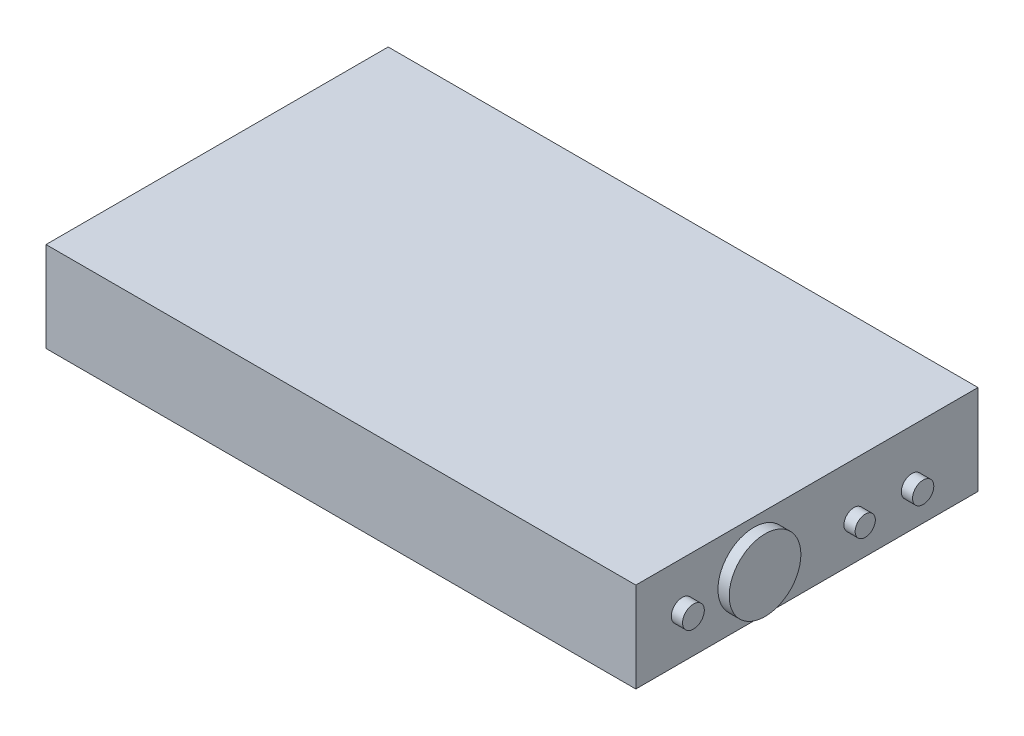
ISO-10303-21;
HEADER;
FILE_DESCRIPTION(('STEP AP214'),'2;1');
FILE_NAME('part.step','',(''),(''),'','','');
FILE_SCHEMA(('AUTOMOTIVE_DESIGN { 1 0 10303 214 1 1 1 1 }'));
ENDSEC;
DATA;
#1=APPLICATION_CONTEXT('core data for automotive mechanical design processes');
#2=APPLICATION_PROTOCOL_DEFINITION('international standard','automotive_design',2000,#1);
#3=PRODUCT_CONTEXT('',#1,'mechanical');
#4=PRODUCT('Part','Part','',(#3));
#5=PRODUCT_RELATED_PRODUCT_CATEGORY('part','',(#4));
#6=PRODUCT_DEFINITION_FORMATION('','',#4);
#7=PRODUCT_DEFINITION_CONTEXT('part definition',#1,'design');
#8=PRODUCT_DEFINITION('design','',#6,#7);
#9=PRODUCT_DEFINITION_SHAPE('','',#8);
#10=(LENGTH_UNIT() NAMED_UNIT(*) SI_UNIT(.MILLI.,.METRE.));
#11=(NAMED_UNIT(*) PLANE_ANGLE_UNIT() SI_UNIT($,.RADIAN.));
#12=(NAMED_UNIT(*) SI_UNIT($,.STERADIAN.) SOLID_ANGLE_UNIT());
#13=UNCERTAINTY_MEASURE_WITH_UNIT(LENGTH_MEASURE(1.E-05),#10,'distance_accuracy_value','');
#14=(GEOMETRIC_REPRESENTATION_CONTEXT(3) GLOBAL_UNCERTAINTY_ASSIGNED_CONTEXT((#13)) GLOBAL_UNIT_ASSIGNED_CONTEXT((#10,
#11,#12)) REPRESENTATION_CONTEXT('',''));
#15=CARTESIAN_POINT('',(0.,0.,0.));
#16=DIRECTION('',(0.,0.,1.));
#17=DIRECTION('',(1.,0.,0.));
#18=AXIS2_PLACEMENT_3D('',#15,#16,#17);
#19=CARTESIAN_POINT('',(0.,50.8,0.));
#20=DIRECTION('',(-1.,0.,0.));
#21=DIRECTION('',(0.,0.,1.));
#22=AXIS2_PLACEMENT_3D('',#19,#20,#21);
#23=PLANE('',#22);
#24=CARTESIAN_POINT('',(0.,21.4279088486174,37.2790976850767));
#25=DIRECTION('',(-1.,0.,0.));
#26=DIRECTION('',(0.,0.,1.));
#27=AXIS2_PLACEMENT_3D('',#24,#25,#26);
#28=CIRCLE('',#27,5.99235517218968);
#29=CARTESIAN_POINT('',(0.,21.4279088486174,43.2714528572664));
#30=VERTEX_POINT('',#29);
#31=EDGE_CURVE('E11',#30,#30,#28,.F.);
#32=ORIENTED_EDGE('',*,*,#31,.F.);
#33=EDGE_LOOP('',(#32));
#34=FACE_BOUND('',#33,.T.);
#35=CARTESIAN_POINT('',(0.,21.4279088486174,69.9637334450343));
#36=DIRECTION('',(-1.,0.,0.));
#37=DIRECTION('',(0.,0.,1.));
#38=AXIS2_PLACEMENT_3D('',#35,#36,#37);
#39=CIRCLE('',#38,5.69254510111583);
#40=CARTESIAN_POINT('',(0.,21.4279088486174,75.6562785461502));
#41=VERTEX_POINT('',#40);
#42=EDGE_CURVE('E50',#41,#41,#39,.F.);
#43=ORIENTED_EDGE('',*,*,#42,.F.);
#44=EDGE_LOOP('',(#43));
#45=FACE_BOUND('',#44,.T.);
#46=CARTESIAN_POINT('',(0.,25.5134883186121,166.882757538798));
#47=DIRECTION('',(-1.,0.,0.));
#48=DIRECTION('',(0.,0.,1.));
#49=AXIS2_PLACEMENT_3D('',#46,#47,#48);
#50=CIRCLE('',#49,6.13257103558854);
#51=CARTESIAN_POINT('',(0.,25.5134883186121,173.015328574386));
#52=VERTEX_POINT('',#51);
#53=EDGE_CURVE('E131',#52,#52,#50,.F.);
#54=ORIENTED_EDGE('',*,*,#53,.F.);
#55=EDGE_LOOP('',(#54));
#56=FACE_BOUND('',#55,.T.);
#57=CARTESIAN_POINT('',(0.,25.5134883186121,126.480916113294));
#58=DIRECTION('',(1.,0.,0.));
#59=DIRECTION('',(0.,0.,-1.));
#60=AXIS2_PLACEMENT_3D('',#57,#58,#59);
#61=CIRCLE('',#60,20.2162167175021);
#62=CARTESIAN_POINT('',(0.,25.5134883186121,106.264699395792));
#63=VERTEX_POINT('',#62);
#64=EDGE_CURVE('E130',#63,#63,#61,.T.);
#65=ORIENTED_EDGE('',*,*,#64,.F.);
#66=EDGE_LOOP('',(#65));
#67=FACE_BOUND('',#66,.T.);
#68=DIRECTION('',(0.,0.,-1.));
#69=VECTOR('',#68,1.);
#70=CARTESIAN_POINT('',(0.,0.,0.));
#71=LINE('',#70,#69);
#72=CARTESIAN_POINT('',(0.,0.,193.04));
#73=VERTEX_POINT('',#72);
#74=CARTESIAN_POINT('',(0.,0.,0.));
#75=VERTEX_POINT('',#74);
#76=EDGE_CURVE('E113',#73,#75,#71,.T.);
#77=ORIENTED_EDGE('',*,*,#76,.T.);
#78=DIRECTION('',(0.,-1.,0.));
#79=VECTOR('',#78,1.);
#80=CARTESIAN_POINT('',(0.,50.8,0.));
#81=LINE('',#80,#79);
#82=CARTESIAN_POINT('',(0.,50.8,0.));
#83=VERTEX_POINT('',#82);
#84=EDGE_CURVE('E102',#83,#75,#81,.T.);
#85=ORIENTED_EDGE('',*,*,#84,.F.);
#86=DIRECTION('',(0.,0.,-1.));
#87=VECTOR('',#86,1.);
#88=CARTESIAN_POINT('',(0.,50.8,0.));
#89=LINE('',#88,#87);
#90=CARTESIAN_POINT('',(0.,50.8,193.04));
#91=VERTEX_POINT('',#90);
#92=EDGE_CURVE('E94',#91,#83,#89,.T.);
#93=ORIENTED_EDGE('',*,*,#92,.F.);
#94=DIRECTION('',(0.,-1.,0.));
#95=VECTOR('',#94,1.);
#96=CARTESIAN_POINT('',(0.,50.8,193.04));
#97=LINE('',#96,#95);
#98=EDGE_CURVE('E109',#91,#73,#97,.T.);
#99=ORIENTED_EDGE('',*,*,#98,.T.);
#100=EDGE_LOOP('',(#77,#85,#93,#99));
#101=FACE_BOUND('',#100,.T.);
#102=ADVANCED_FACE('F41',(#34,#45,#56,#67,#101),#23,.F.);
#103=CARTESIAN_POINT('',(0.,50.8,0.));
#104=DIRECTION('',(0.,0.,1.));
#105=DIRECTION('',(1.,0.,0.));
#106=AXIS2_PLACEMENT_3D('',#103,#104,#105);
#107=PLANE('',#106);
#108=DIRECTION('',(-1.,0.,0.));
#109=VECTOR('',#108,1.);
#110=CARTESIAN_POINT('',(0.,0.,0.));
#111=LINE('',#110,#109);
#112=CARTESIAN_POINT('',(-332.74,0.,0.));
#113=VERTEX_POINT('',#112);
#114=EDGE_CURVE('E100',#75,#113,#111,.T.);
#115=ORIENTED_EDGE('',*,*,#114,.T.);
#116=DIRECTION('',(0.,-1.,0.));
#117=VECTOR('',#116,1.);
#118=CARTESIAN_POINT('',(-332.74,50.8,0.));
#119=LINE('',#118,#117);
#120=CARTESIAN_POINT('',(-332.74,50.8,0.));
#121=VERTEX_POINT('',#120);
#122=EDGE_CURVE('E98',#121,#113,#119,.T.);
#123=ORIENTED_EDGE('',*,*,#122,.F.);
#124=DIRECTION('',(-1.,0.,0.));
#125=VECTOR('',#124,1.);
#126=CARTESIAN_POINT('',(0.,50.8,0.));
#127=LINE('',#126,#125);
#128=EDGE_CURVE('E89',#83,#121,#127,.T.);
#129=ORIENTED_EDGE('',*,*,#128,.F.);
#130=ORIENTED_EDGE('',*,*,#84,.T.);
#131=EDGE_LOOP('',(#115,#123,#129,#130));
#132=FACE_BOUND('',#131,.T.);
#133=ADVANCED_FACE('F99',(#132),#107,.F.);
#134=CARTESIAN_POINT('',(-332.74,50.8,0.));
#135=DIRECTION('',(1.,0.,0.));
#136=DIRECTION('',(0.,0.,-1.));
#137=AXIS2_PLACEMENT_3D('',#134,#135,#136);
#138=PLANE('',#137);
#139=DIRECTION('',(0.,0.,1.));
#140=VECTOR('',#139,1.);
#141=CARTESIAN_POINT('',(-332.74,0.,0.));
#142=LINE('',#141,#140);
#143=CARTESIAN_POINT('',(-332.74,0.,193.04));
#144=VERTEX_POINT('',#143);
#145=EDGE_CURVE('E75',#113,#144,#142,.T.);
#146=ORIENTED_EDGE('',*,*,#145,.T.);
#147=DIRECTION('',(0.,-1.,0.));
#148=VECTOR('',#147,1.);
#149=CARTESIAN_POINT('',(-332.74,50.8,193.04));
#150=LINE('',#149,#148);
#151=CARTESIAN_POINT('',(-332.74,50.8,193.04));
#152=VERTEX_POINT('',#151);
#153=EDGE_CURVE('E103',#152,#144,#150,.T.);
#154=ORIENTED_EDGE('',*,*,#153,.F.);
#155=DIRECTION('',(0.,0.,1.));
#156=VECTOR('',#155,1.);
#157=CARTESIAN_POINT('',(-332.74,50.8,0.));
#158=LINE('',#157,#156);
#159=EDGE_CURVE('E92',#121,#152,#158,.T.);
#160=ORIENTED_EDGE('',*,*,#159,.F.);
#161=ORIENTED_EDGE('',*,*,#122,.T.);
#162=EDGE_LOOP('',(#146,#154,#160,#161));
#163=FACE_BOUND('',#162,.T.);
#164=ADVANCED_FACE('F105',(#163),#138,.F.);
#165=CARTESIAN_POINT('',(0.,50.8,193.04));
#166=DIRECTION('',(0.,0.,-1.));
#167=DIRECTION('',(-1.,0.,0.));
#168=AXIS2_PLACEMENT_3D('',#165,#166,#167);
#169=PLANE('',#168);
#170=DIRECTION('',(1.,0.,0.));
#171=VECTOR('',#170,1.);
#172=CARTESIAN_POINT('',(0.,0.,193.04));
#173=LINE('',#172,#171);
#174=EDGE_CURVE('E81',#144,#73,#173,.T.);
#175=ORIENTED_EDGE('',*,*,#174,.T.);
#176=ORIENTED_EDGE('',*,*,#98,.F.);
#177=DIRECTION('',(1.,0.,0.));
#178=VECTOR('',#177,1.);
#179=CARTESIAN_POINT('',(0.,50.8,193.04));
#180=LINE('',#179,#178);
#181=EDGE_CURVE('E58',#152,#91,#180,.T.);
#182=ORIENTED_EDGE('',*,*,#181,.F.);
#183=ORIENTED_EDGE('',*,*,#153,.T.);
#184=EDGE_LOOP('',(#175,#176,#182,#183));
#185=FACE_BOUND('',#184,.T.);
#186=ADVANCED_FACE('F161',(#185),#169,.F.);
#187=CARTESIAN_POINT('',(0.,50.8,0.));
#188=DIRECTION('',(0.,-1.,0.));
#189=DIRECTION('',(0.,0.,-1.));
#190=AXIS2_PLACEMENT_3D('',#187,#188,#189);
#191=PLANE('',#190);
#192=ORIENTED_EDGE('',*,*,#92,.T.);
#193=ORIENTED_EDGE('',*,*,#128,.T.);
#194=ORIENTED_EDGE('',*,*,#159,.T.);
#195=ORIENTED_EDGE('',*,*,#181,.T.);
#196=EDGE_LOOP('',(#192,#193,#194,#195));
#197=FACE_BOUND('',#196,.T.);
#198=ADVANCED_FACE('F90',(#197),#191,.F.);
#199=CARTESIAN_POINT('',(0.,0.,0.));
#200=DIRECTION('',(0.,-1.,0.));
#201=DIRECTION('',(0.,0.,-1.));
#202=AXIS2_PLACEMENT_3D('',#199,#200,#201);
#203=PLANE('',#202);
#204=ORIENTED_EDGE('',*,*,#76,.F.);
#205=ORIENTED_EDGE('',*,*,#174,.F.);
#206=ORIENTED_EDGE('',*,*,#145,.F.);
#207=ORIENTED_EDGE('',*,*,#114,.F.);
#208=EDGE_LOOP('',(#204,#205,#206,#207));
#209=FACE_BOUND('',#208,.T.);
#210=ADVANCED_FACE('F150',(#209),#203,.T.);
#211=CARTESIAN_POINT('',(6.35000000000002,25.5134883186121,126.480916113294));
#212=DIRECTION('',(-1.,0.,0.));
#213=DIRECTION('',(0.,0.,1.));
#214=AXIS2_PLACEMENT_3D('',#211,#212,#213);
#215=CYLINDRICAL_SURFACE('',#214,20.2162167175021);
#216=CARTESIAN_POINT('',(6.35000000000002,25.5134883186121,126.480916113294));
#217=DIRECTION('',(1.,0.,0.));
#218=DIRECTION('',(0.,0.,-1.));
#219=AXIS2_PLACEMENT_3D('',#216,#217,#218);
#220=CIRCLE('',#219,20.2162167175021);
#221=CARTESIAN_POINT('',(6.35000000000001,25.5134883186121,106.264699395792));
#222=VERTEX_POINT('',#221);
#223=EDGE_CURVE('E117',#222,#222,#220,.T.);
#224=ORIENTED_EDGE('',*,*,#223,.F.);
#225=EDGE_LOOP('',(#224));
#226=FACE_BOUND('',#225,.T.);
#227=ORIENTED_EDGE('',*,*,#64,.T.);
#228=EDGE_LOOP('',(#227));
#229=FACE_BOUND('',#228,.T.);
#230=ADVANCED_FACE('F152',(#226,#229),#215,.T.);
#231=CARTESIAN_POINT('',(6.35000000000002,25.5134883186121,126.480916113294));
#232=DIRECTION('',(1.,0.,0.));
#233=DIRECTION('',(0.,0.,-1.));
#234=AXIS2_PLACEMENT_3D('',#231,#232,#233);
#235=PLANE('',#234);
#236=ORIENTED_EDGE('',*,*,#223,.T.);
#237=EDGE_LOOP('',(#236));
#238=FACE_BOUND('',#237,.T.);
#239=ADVANCED_FACE('F158',(#238),#235,.T.);
#240=CARTESIAN_POINT('',(6.35000000000002,25.5134883186121,166.882757538798));
#241=DIRECTION('',(-1.,0.,0.));
#242=DIRECTION('',(0.,0.,1.));
#243=AXIS2_PLACEMENT_3D('',#240,#241,#242);
#244=CYLINDRICAL_SURFACE('',#243,6.13257103558854);
#245=CARTESIAN_POINT('',(6.35000000000002,25.5134883186121,166.882757538798));
#246=DIRECTION('',(1.,0.,0.));
#247=DIRECTION('',(0.,0.,-1.));
#248=AXIS2_PLACEMENT_3D('',#245,#246,#247);
#249=CIRCLE('',#248,6.13257103558854);
#250=CARTESIAN_POINT('',(6.35000000000002,25.5134883186121,160.750186503209));
#251=VERTEX_POINT('',#250);
#252=EDGE_CURVE('E287',#251,#251,#249,.T.);
#253=ORIENTED_EDGE('',*,*,#252,.F.);
#254=EDGE_LOOP('',(#253));
#255=FACE_BOUND('',#254,.T.);
#256=ORIENTED_EDGE('',*,*,#53,.T.);
#257=EDGE_LOOP('',(#256));
#258=FACE_BOUND('',#257,.T.);
#259=ADVANCED_FACE('F216',(#255,#258),#244,.T.);
#260=CARTESIAN_POINT('',(6.35000000000002,25.5134883186121,166.882757538798));
#261=DIRECTION('',(1.,0.,0.));
#262=DIRECTION('',(0.,0.,-1.));
#263=AXIS2_PLACEMENT_3D('',#260,#261,#262);
#264=PLANE('',#263);
#265=ORIENTED_EDGE('',*,*,#252,.T.);
#266=EDGE_LOOP('',(#265));
#267=FACE_BOUND('',#266,.T.);
#268=ADVANCED_FACE('F226',(#267),#264,.T.);
#269=CARTESIAN_POINT('',(6.35000000000001,21.4279088486174,69.9637334450343));
#270=DIRECTION('',(-1.,0.,0.));
#271=DIRECTION('',(0.,0.,1.));
#272=AXIS2_PLACEMENT_3D('',#269,#270,#271);
#273=CYLINDRICAL_SURFACE('',#272,5.69254510111583);
#274=CARTESIAN_POINT('',(6.35000000000001,21.4279088486174,69.9637334450343));
#275=DIRECTION('',(1.,0.,0.));
#276=DIRECTION('',(0.,0.,-1.));
#277=AXIS2_PLACEMENT_3D('',#274,#275,#276);
#278=CIRCLE('',#277,5.69254510111583);
#279=CARTESIAN_POINT('',(6.35000000000001,21.4279088486174,64.2711883439185));
#280=VERTEX_POINT('',#279);
#281=EDGE_CURVE('E283',#280,#280,#278,.T.);
#282=ORIENTED_EDGE('',*,*,#281,.F.);
#283=EDGE_LOOP('',(#282));
#284=FACE_BOUND('',#283,.T.);
#285=ORIENTED_EDGE('',*,*,#42,.T.);
#286=EDGE_LOOP('',(#285));
#287=FACE_BOUND('',#286,.T.);
#288=ADVANCED_FACE('F138',(#284,#287),#273,.T.);
#289=CARTESIAN_POINT('',(6.35000000000001,21.4279088486174,69.9637334450343));
#290=DIRECTION('',(1.,0.,0.));
#291=DIRECTION('',(0.,0.,-1.));
#292=AXIS2_PLACEMENT_3D('',#289,#290,#291);
#293=PLANE('',#292);
#294=ORIENTED_EDGE('',*,*,#281,.T.);
#295=EDGE_LOOP('',(#294));
#296=FACE_BOUND('',#295,.T.);
#297=ADVANCED_FACE('F245',(#296),#293,.T.);
#298=CARTESIAN_POINT('',(6.35,21.4279088486174,37.2790976850767));
#299=DIRECTION('',(-1.,0.,0.));
#300=DIRECTION('',(0.,0.,1.));
#301=AXIS2_PLACEMENT_3D('',#298,#299,#300);
#302=CYLINDRICAL_SURFACE('',#301,5.99235517218968);
#303=CARTESIAN_POINT('',(6.35,21.4279088486174,37.2790976850767));
#304=DIRECTION('',(1.,0.,0.));
#305=DIRECTION('',(0.,0.,-1.));
#306=AXIS2_PLACEMENT_3D('',#303,#304,#305);
#307=CIRCLE('',#306,5.99235517218968);
#308=CARTESIAN_POINT('',(6.35,21.4279088486174,31.2867425128871));
#309=VERTEX_POINT('',#308);
#310=EDGE_CURVE('E281',#309,#309,#307,.T.);
#311=ORIENTED_EDGE('',*,*,#310,.F.);
#312=EDGE_LOOP('',(#311));
#313=FACE_BOUND('',#312,.T.);
#314=ORIENTED_EDGE('',*,*,#31,.T.);
#315=EDGE_LOOP('',(#314));
#316=FACE_BOUND('',#315,.T.);
#317=ADVANCED_FACE('F255',(#313,#316),#302,.T.);
#318=CARTESIAN_POINT('',(6.35,21.4279088486174,37.2790976850767));
#319=DIRECTION('',(1.,0.,0.));
#320=DIRECTION('',(0.,0.,-1.));
#321=AXIS2_PLACEMENT_3D('',#318,#319,#320);
#322=PLANE('',#321);
#323=ORIENTED_EDGE('',*,*,#310,.T.);
#324=EDGE_LOOP('',(#323));
#325=FACE_BOUND('',#324,.T.);
#326=ADVANCED_FACE('F265',(#325),#322,.T.);
#327=CLOSED_SHELL('',(#102,#133,#164,#186,#198,#210,#230,#239,#259,#268,#288,#297,#317,#326));
#328=MANIFOLD_SOLID_BREP('B2',#327);
#329=ADVANCED_BREP_SHAPE_REPRESENTATION('',(#18,#328),#14);
#330=SHAPE_DEFINITION_REPRESENTATION(#9,#329);
ENDSEC;
END-ISO-10303-21;
